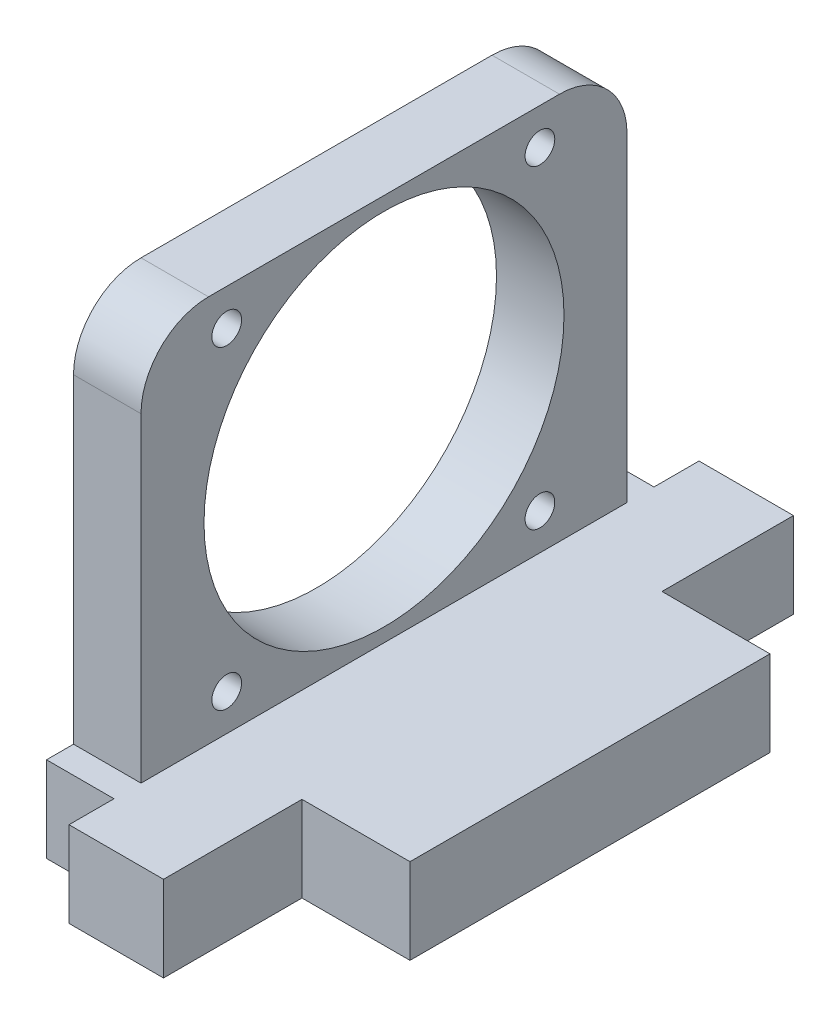
ISO-10303-21;
HEADER;
FILE_DESCRIPTION(('STEP AP214'),'2;1');
FILE_NAME('part.step','',(''),(''),'','','');
FILE_SCHEMA(('AUTOMOTIVE_DESIGN { 1 0 10303 214 1 1 1 1 }'));
ENDSEC;
DATA;
#1=APPLICATION_CONTEXT('core data for automotive mechanical design processes');
#2=APPLICATION_PROTOCOL_DEFINITION('international standard','automotive_design',2000,#1);
#3=PRODUCT_CONTEXT('',#1,'mechanical');
#4=PRODUCT('Part','Part','',(#3));
#5=PRODUCT_RELATED_PRODUCT_CATEGORY('part','',(#4));
#6=PRODUCT_DEFINITION_FORMATION('','',#4);
#7=PRODUCT_DEFINITION_CONTEXT('part definition',#1,'design');
#8=PRODUCT_DEFINITION('design','',#6,#7);
#9=PRODUCT_DEFINITION_SHAPE('','',#8);
#10=(LENGTH_UNIT() NAMED_UNIT(*) SI_UNIT(.MILLI.,.METRE.));
#11=(NAMED_UNIT(*) PLANE_ANGLE_UNIT() SI_UNIT($,.RADIAN.));
#12=(NAMED_UNIT(*) SI_UNIT($,.STERADIAN.) SOLID_ANGLE_UNIT());
#13=UNCERTAINTY_MEASURE_WITH_UNIT(LENGTH_MEASURE(1.E-05),#10,'distance_accuracy_value','');
#14=(GEOMETRIC_REPRESENTATION_CONTEXT(3) GLOBAL_UNCERTAINTY_ASSIGNED_CONTEXT((#13)) GLOBAL_UNIT_ASSIGNED_CONTEXT((#10,
#11,#12)) REPRESENTATION_CONTEXT('',''));
#15=CARTESIAN_POINT('',(0.,0.,0.));
#16=DIRECTION('',(0.,0.,1.));
#17=DIRECTION('',(1.,0.,0.));
#18=AXIS2_PLACEMENT_3D('',#15,#16,#17);
#19=CARTESIAN_POINT('',(0.,0.,120.));
#20=DIRECTION('',(0.,0.,1.));
#21=DIRECTION('',(1.,0.,0.));
#22=AXIS2_PLACEMENT_3D('',#19,#20,#21);
#23=PLANE('',#22);
#24=DIRECTION('',(1.,0.,0.));
#25=VECTOR('',#24,1.);
#26=CARTESIAN_POINT('',(0.,0.,120.));
#27=LINE('',#26,#25);
#28=CARTESIAN_POINT('',(0.,0.,120.));
#29=VERTEX_POINT('',#28);
#30=CARTESIAN_POINT('',(15.,0.,120.));
#31=VERTEX_POINT('',#30);
#32=EDGE_CURVE('E341',#29,#31,#27,.T.);
#33=ORIENTED_EDGE('',*,*,#32,.T.);
#34=DIRECTION('',(0.,1.,0.));
#35=VECTOR('',#34,1.);
#36=CARTESIAN_POINT('',(15.,-23.259406699226,120.));
#37=LINE('',#36,#35);
#38=CARTESIAN_POINT('',(15.,19.,120.));
#39=VERTEX_POINT('',#38);
#40=EDGE_CURVE('E200',#31,#39,#37,.T.);
#41=ORIENTED_EDGE('',*,*,#40,.T.);
#42=DIRECTION('',(-1.,0.,0.));
#43=VECTOR('',#42,1.);
#44=CARTESIAN_POINT('',(60.,19.,120.));
#45=LINE('',#44,#43);
#46=CARTESIAN_POINT('',(0.,19.,120.));
#47=VERTEX_POINT('',#46);
#48=EDGE_CURVE('E346',#39,#47,#45,.T.);
#49=ORIENTED_EDGE('',*,*,#48,.T.);
#50=DIRECTION('',(0.,-1.,0.));
#51=VECTOR('',#50,1.);
#52=CARTESIAN_POINT('',(0.,105.1,120.));
#53=LINE('',#52,#51);
#54=EDGE_CURVE('E338',#47,#29,#53,.T.);
#55=ORIENTED_EDGE('',*,*,#54,.T.);
#56=EDGE_LOOP('',(#33,#41,#49,#55));
#57=FACE_BOUND('',#56,.T.);
#58=ADVANCED_FACE('F43',(#57),#23,.T.);
#59=CARTESIAN_POINT('',(0.,0.,0.));
#60=DIRECTION('',(0.,0.,1.));
#61=DIRECTION('',(1.,0.,0.));
#62=AXIS2_PLACEMENT_3D('',#59,#60,#61);
#63=PLANE('',#62);
#64=DIRECTION('',(0.,1.,0.));
#65=VECTOR('',#64,1.);
#66=CARTESIAN_POINT('',(15.,-23.259406699226,0.));
#67=LINE('',#66,#65);
#68=CARTESIAN_POINT('',(15.,0.,0.));
#69=VERTEX_POINT('',#68);
#70=CARTESIAN_POINT('',(15.,19.,0.));
#71=VERTEX_POINT('',#70);
#72=EDGE_CURVE('E67',#69,#71,#67,.T.);
#73=ORIENTED_EDGE('',*,*,#72,.F.);
#74=DIRECTION('',(1.,0.,0.));
#75=VECTOR('',#74,1.);
#76=CARTESIAN_POINT('',(0.,0.,0.));
#77=LINE('',#76,#75);
#78=CARTESIAN_POINT('',(0.,0.,0.));
#79=VERTEX_POINT('',#78);
#80=EDGE_CURVE('E352',#79,#69,#77,.T.);
#81=ORIENTED_EDGE('',*,*,#80,.F.);
#82=DIRECTION('',(0.,-1.,0.));
#83=VECTOR('',#82,1.);
#84=CARTESIAN_POINT('',(0.,105.1,0.));
#85=LINE('',#84,#83);
#86=CARTESIAN_POINT('',(0.,19.,0.));
#87=VERTEX_POINT('',#86);
#88=EDGE_CURVE('E334',#87,#79,#85,.T.);
#89=ORIENTED_EDGE('',*,*,#88,.F.);
#90=DIRECTION('',(-1.,0.,0.));
#91=VECTOR('',#90,1.);
#92=CARTESIAN_POINT('',(60.,19.,0.));
#93=LINE('',#92,#91);
#94=EDGE_CURVE('E342',#71,#87,#93,.T.);
#95=ORIENTED_EDGE('',*,*,#94,.F.);
#96=EDGE_LOOP('',(#73,#81,#89,#95));
#97=FACE_BOUND('',#96,.T.);
#98=ADVANCED_FACE('F426',(#97),#63,.F.);
#99=CARTESIAN_POINT('',(0.,105.1,120.));
#100=DIRECTION('',(1.,0.,0.));
#101=DIRECTION('',(0.,1.,0.));
#102=AXIS2_PLACEMENT_3D('',#99,#100,#101);
#103=PLANE('',#102);
#104=CARTESIAN_POINT('',(0.,27.1,25.35));
#105=DIRECTION('',(1.,0.,0.));
#106=DIRECTION('',(0.,0.,1.));
#107=AXIS2_PLACEMENT_3D('',#104,#105,#106);
#108=CIRCLE('',#107,3.3);
#109=CARTESIAN_POINT('',(0.,27.1,28.65));
#110=VERTEX_POINT('',#109);
#111=EDGE_CURVE('E285',#110,#110,#108,.T.);
#112=ORIENTED_EDGE('',*,*,#111,.T.);
#113=EDGE_LOOP('',(#112));
#114=FACE_BOUND('',#113,.T.);
#115=CARTESIAN_POINT('',(0.,97.,25.35));
#116=DIRECTION('',(1.,0.,0.));
#117=DIRECTION('',(0.,0.,-1.));
#118=AXIS2_PLACEMENT_3D('',#115,#116,#117);
#119=CIRCLE('',#118,3.3);
#120=CARTESIAN_POINT('',(0.,97.,22.05));
#121=VERTEX_POINT('',#120);
#122=EDGE_CURVE('E319',#121,#121,#119,.T.);
#123=ORIENTED_EDGE('',*,*,#122,.T.);
#124=EDGE_LOOP('',(#123));
#125=FACE_BOUND('',#124,.T.);
#126=CARTESIAN_POINT('',(0.,27.1,94.95));
#127=DIRECTION('',(1.,0.,0.));
#128=DIRECTION('',(0.,0.,1.));
#129=AXIS2_PLACEMENT_3D('',#126,#127,#128);
#130=CIRCLE('',#129,3.29999999999999);
#131=CARTESIAN_POINT('',(0.,27.1,98.25));
#132=VERTEX_POINT('',#131);
#133=EDGE_CURVE('E311',#132,#132,#130,.T.);
#134=ORIENTED_EDGE('',*,*,#133,.T.);
#135=EDGE_LOOP('',(#134));
#136=FACE_BOUND('',#135,.T.);
#137=CARTESIAN_POINT('',(0.,97.,94.95));
#138=DIRECTION('',(1.,0.,0.));
#139=DIRECTION('',(0.,0.,-1.));
#140=AXIS2_PLACEMENT_3D('',#137,#138,#139);
#141=CIRCLE('',#140,3.29999999999999);
#142=CARTESIAN_POINT('',(0.,97.,91.65));
#143=VERTEX_POINT('',#142);
#144=EDGE_CURVE('E303',#143,#143,#141,.T.);
#145=ORIENTED_EDGE('',*,*,#144,.T.);
#146=EDGE_LOOP('',(#145));
#147=FACE_BOUND('',#146,.T.);
#148=CARTESIAN_POINT('',(0.,62.05,60.));
#149=DIRECTION('',(1.,0.,0.));
#150=DIRECTION('',(0.,0.,-1.));
#151=AXIS2_PLACEMENT_3D('',#148,#149,#150);
#152=CIRCLE('',#151,40.);
#153=CARTESIAN_POINT('',(0.,62.05,20.));
#154=VERTEX_POINT('',#153);
#155=EDGE_CURVE('E330',#154,#154,#152,.T.);
#156=ORIENTED_EDGE('',*,*,#155,.T.);
#157=EDGE_LOOP('',(#156));
#158=FACE_BOUND('',#157,.T.);
#159=DIRECTION('',(0.,0.,-1.));
#160=VECTOR('',#159,1.);
#161=CARTESIAN_POINT('',(0.,105.1,120.));
#162=LINE('',#161,#160);
#163=CARTESIAN_POINT('',(0.,105.1,99.));
#164=VERTEX_POINT('',#163);
#165=CARTESIAN_POINT('',(0.,105.1,21.));
#166=VERTEX_POINT('',#165);
#167=EDGE_CURVE('E349',#164,#166,#162,.T.);
#168=ORIENTED_EDGE('',*,*,#167,.T.);
#169=CARTESIAN_POINT('',(0.,90.1,21.));
#170=DIRECTION('',(1.,0.,0.));
#171=DIRECTION('',(0.,1.,0.));
#172=AXIS2_PLACEMENT_3D('',#169,#170,#171);
#173=CIRCLE('',#172,15.);
#174=CARTESIAN_POINT('',(0.,90.1,6.));
#175=VERTEX_POINT('',#174);
#176=EDGE_CURVE('E391',#166,#175,#173,.F.);
#177=ORIENTED_EDGE('',*,*,#176,.T.);
#178=DIRECTION('',(0.,-1.,0.));
#179=VECTOR('',#178,1.);
#180=CARTESIAN_POINT('',(0.,121.255494421404,6.));
#181=LINE('',#180,#179);
#182=CARTESIAN_POINT('',(0.,19.,6.));
#183=VERTEX_POINT('',#182);
#184=EDGE_CURVE('E282',#175,#183,#181,.T.);
#185=ORIENTED_EDGE('',*,*,#184,.T.);
#186=DIRECTION('',(0.,0.,1.));
#187=VECTOR('',#186,1.);
#188=CARTESIAN_POINT('',(0.,19.,0.));
#189=LINE('',#188,#187);
#190=EDGE_CURVE('E270',#87,#183,#189,.T.);
#191=ORIENTED_EDGE('',*,*,#190,.F.);
#192=ORIENTED_EDGE('',*,*,#88,.T.);
#193=DIRECTION('',(0.,0.,-1.));
#194=VECTOR('',#193,1.);
#195=CARTESIAN_POINT('',(0.,0.,120.));
#196=LINE('',#195,#194);
#197=EDGE_CURVE('E376',#29,#79,#196,.T.);
#198=ORIENTED_EDGE('',*,*,#197,.F.);
#199=ORIENTED_EDGE('',*,*,#54,.F.);
#200=DIRECTION('',(0.,0.,1.));
#201=VECTOR('',#200,1.);
#202=CARTESIAN_POINT('',(0.,19.,120.));
#203=LINE('',#202,#201);
#204=CARTESIAN_POINT('',(0.,19.,114.));
#205=VERTEX_POINT('',#204);
#206=EDGE_CURVE('E291',#205,#47,#203,.T.);
#207=ORIENTED_EDGE('',*,*,#206,.F.);
#208=DIRECTION('',(0.,-1.,0.));
#209=VECTOR('',#208,1.);
#210=CARTESIAN_POINT('',(0.,121.255494421404,114.));
#211=LINE('',#210,#209);
#212=CARTESIAN_POINT('',(0.,90.1,114.));
#213=VERTEX_POINT('',#212);
#214=EDGE_CURVE('E288',#213,#205,#211,.T.);
#215=ORIENTED_EDGE('',*,*,#214,.F.);
#216=CARTESIAN_POINT('',(0.,90.1,99.));
#217=DIRECTION('',(1.,0.,0.));
#218=DIRECTION('',(0.,1.,0.));
#219=AXIS2_PLACEMENT_3D('',#216,#217,#218);
#220=CIRCLE('',#219,15.);
#221=EDGE_CURVE('E388',#213,#164,#220,.F.);
#222=ORIENTED_EDGE('',*,*,#221,.T.);
#223=EDGE_LOOP('',(#168,#177,#185,#191,#192,#198,#199,#207,#215,#222));
#224=FACE_BOUND('',#223,.T.);
#225=ADVANCED_FACE('F415',(#114,#125,#136,#147,#158,#224),#103,.F.);
#226=CARTESIAN_POINT('',(15.,19.,120.));
#227=DIRECTION('',(-1.,0.,0.));
#228=DIRECTION('',(0.,0.,1.));
#229=AXIS2_PLACEMENT_3D('',#226,#227,#228);
#230=PLANE('',#229);
#231=CARTESIAN_POINT('',(15.,27.1,25.35));
#232=DIRECTION('',(1.,0.,0.));
#233=DIRECTION('',(0.,0.,1.));
#234=AXIS2_PLACEMENT_3D('',#231,#232,#233);
#235=CIRCLE('',#234,3.3);
#236=CARTESIAN_POINT('',(15.,27.1,28.65));
#237=VERTEX_POINT('',#236);
#238=EDGE_CURVE('E323',#237,#237,#235,.T.);
#239=ORIENTED_EDGE('',*,*,#238,.F.);
#240=EDGE_LOOP('',(#239));
#241=FACE_BOUND('',#240,.T.);
#242=CARTESIAN_POINT('',(15.,97.,25.35));
#243=DIRECTION('',(1.,0.,0.));
#244=DIRECTION('',(0.,0.,-1.));
#245=AXIS2_PLACEMENT_3D('',#242,#243,#244);
#246=CIRCLE('',#245,3.3);
#247=CARTESIAN_POINT('',(15.,97.,22.05));
#248=VERTEX_POINT('',#247);
#249=EDGE_CURVE('E315',#248,#248,#246,.T.);
#250=ORIENTED_EDGE('',*,*,#249,.F.);
#251=EDGE_LOOP('',(#250));
#252=FACE_BOUND('',#251,.T.);
#253=CARTESIAN_POINT('',(15.,27.1,94.95));
#254=DIRECTION('',(1.,0.,0.));
#255=DIRECTION('',(0.,0.,1.));
#256=AXIS2_PLACEMENT_3D('',#253,#254,#255);
#257=CIRCLE('',#256,3.29999999999999);
#258=CARTESIAN_POINT('',(15.,27.1,98.25));
#259=VERTEX_POINT('',#258);
#260=EDGE_CURVE('E307',#259,#259,#257,.T.);
#261=ORIENTED_EDGE('',*,*,#260,.F.);
#262=EDGE_LOOP('',(#261));
#263=FACE_BOUND('',#262,.T.);
#264=CARTESIAN_POINT('',(15.,97.,94.95));
#265=DIRECTION('',(1.,0.,0.));
#266=DIRECTION('',(0.,0.,-1.));
#267=AXIS2_PLACEMENT_3D('',#264,#265,#266);
#268=CIRCLE('',#267,3.29999999999999);
#269=CARTESIAN_POINT('',(15.,97.,91.65));
#270=VERTEX_POINT('',#269);
#271=EDGE_CURVE('E298',#270,#270,#268,.T.);
#272=ORIENTED_EDGE('',*,*,#271,.F.);
#273=EDGE_LOOP('',(#272));
#274=FACE_BOUND('',#273,.T.);
#275=CARTESIAN_POINT('',(15.,62.05,60.));
#276=DIRECTION('',(1.,0.,0.));
#277=DIRECTION('',(0.,0.,-1.));
#278=AXIS2_PLACEMENT_3D('',#275,#276,#277);
#279=CIRCLE('',#278,40.);
#280=CARTESIAN_POINT('',(15.,62.05,20.));
#281=VERTEX_POINT('',#280);
#282=EDGE_CURVE('E302',#281,#281,#279,.T.);
#283=ORIENTED_EDGE('',*,*,#282,.F.);
#284=EDGE_LOOP('',(#283));
#285=FACE_BOUND('',#284,.T.);
#286=DIRECTION('',(0.,-1.,0.));
#287=VECTOR('',#286,1.);
#288=CARTESIAN_POINT('',(15.,121.255494421404,6.00000000000001));
#289=LINE('',#288,#287);
#290=CARTESIAN_POINT('',(15.,90.1,6.00000000000001));
#291=VERTEX_POINT('',#290);
#292=CARTESIAN_POINT('',(15.,19.,6.00000000000001));
#293=VERTEX_POINT('',#292);
#294=EDGE_CURVE('E279',#291,#293,#289,.T.);
#295=ORIENTED_EDGE('',*,*,#294,.F.);
#296=CARTESIAN_POINT('',(15.,90.1,21.));
#297=DIRECTION('',(-1.,0.,0.));
#298=DIRECTION('',(0.,0.,1.));
#299=AXIS2_PLACEMENT_3D('',#296,#297,#298);
#300=CIRCLE('',#299,15.);
#301=CARTESIAN_POINT('',(15.,105.1,21.));
#302=VERTEX_POINT('',#301);
#303=EDGE_CURVE('E52',#291,#302,#300,.F.);
#304=ORIENTED_EDGE('',*,*,#303,.T.);
#305=DIRECTION('',(0.,0.,-1.));
#306=VECTOR('',#305,1.);
#307=CARTESIAN_POINT('',(15.,105.1,120.));
#308=LINE('',#307,#306);
#309=CARTESIAN_POINT('',(15.,105.1,99.));
#310=VERTEX_POINT('',#309);
#311=EDGE_CURVE('E360',#310,#302,#308,.T.);
#312=ORIENTED_EDGE('',*,*,#311,.F.);
#313=CARTESIAN_POINT('',(15.,90.1,99.));
#314=DIRECTION('',(-1.,0.,0.));
#315=DIRECTION('',(0.,0.,1.));
#316=AXIS2_PLACEMENT_3D('',#313,#314,#315);
#317=CIRCLE('',#316,15.);
#318=CARTESIAN_POINT('',(15.,90.1,114.));
#319=VERTEX_POINT('',#318);
#320=EDGE_CURVE('E397',#310,#319,#317,.F.);
#321=ORIENTED_EDGE('',*,*,#320,.T.);
#322=DIRECTION('',(0.,-1.,0.));
#323=VECTOR('',#322,1.);
#324=CARTESIAN_POINT('',(15.,121.255494421404,114.));
#325=LINE('',#324,#323);
#326=CARTESIAN_POINT('',(15.,19.,114.));
#327=VERTEX_POINT('',#326);
#328=EDGE_CURVE('E247',#319,#327,#325,.T.);
#329=ORIENTED_EDGE('',*,*,#328,.T.);
#330=DIRECTION('',(0.,0.,-1.));
#331=VECTOR('',#330,1.);
#332=CARTESIAN_POINT('',(15.,19.,120.));
#333=LINE('',#332,#331);
#334=EDGE_CURVE('E364',#327,#293,#333,.T.);
#335=ORIENTED_EDGE('',*,*,#334,.T.);
#336=EDGE_LOOP('',(#295,#304,#312,#321,#329,#335));
#337=FACE_BOUND('',#336,.T.);
#338=ADVANCED_FACE('F404',(#241,#252,#263,#274,#285,#337),#230,.F.);
#339=CARTESIAN_POINT('',(15.,105.1,120.));
#340=DIRECTION('',(0.,-1.,0.));
#341=DIRECTION('',(0.,0.,-1.));
#342=AXIS2_PLACEMENT_3D('',#339,#340,#341);
#343=PLANE('',#342);
#344=ORIENTED_EDGE('',*,*,#311,.T.);
#345=DIRECTION('',(-1.,0.,0.));
#346=VECTOR('',#345,1.);
#347=CARTESIAN_POINT('',(0.,105.1,21.));
#348=LINE('',#347,#346);
#349=EDGE_CURVE('E384',#302,#166,#348,.T.);
#350=ORIENTED_EDGE('',*,*,#349,.T.);
#351=ORIENTED_EDGE('',*,*,#167,.F.);
#352=DIRECTION('',(1.,0.,0.));
#353=VECTOR('',#352,1.);
#354=CARTESIAN_POINT('',(15.,105.1,99.));
#355=LINE('',#354,#353);
#356=EDGE_CURVE('E380',#164,#310,#355,.T.);
#357=ORIENTED_EDGE('',*,*,#356,.T.);
#358=EDGE_LOOP('',(#344,#350,#351,#357));
#359=FACE_BOUND('',#358,.T.);
#360=ADVANCED_FACE('F409',(#359),#343,.F.);
#361=CARTESIAN_POINT('',(0.,0.,120.));
#362=DIRECTION('',(0.,1.,0.));
#363=DIRECTION('',(0.,0.,1.));
#364=AXIS2_PLACEMENT_3D('',#361,#362,#363);
#365=PLANE('',#364);
#366=DIRECTION('',(-1.,0.,0.));
#367=VECTOR('',#366,1.);
#368=CARTESIAN_POINT('',(60.,0.,99.2244017278364));
#369=LINE('',#368,#367);
#370=CARTESIAN_POINT('',(60.,0.,99.2244017278364));
#371=VERTEX_POINT('',#370);
#372=CARTESIAN_POINT('',(36.,0.,99.2244017278364));
#373=VERTEX_POINT('',#372);
#374=EDGE_CURVE('E176',#371,#373,#369,.T.);
#375=ORIENTED_EDGE('',*,*,#374,.T.);
#376=DIRECTION('',(0.,0.,1.));
#377=VECTOR('',#376,1.);
#378=CARTESIAN_POINT('',(36.,0.,120.));
#379=LINE('',#378,#377);
#380=CARTESIAN_POINT('',(36.,0.,130.));
#381=VERTEX_POINT('',#380);
#382=EDGE_CURVE('E170',#373,#381,#379,.T.);
#383=ORIENTED_EDGE('',*,*,#382,.T.);
#384=DIRECTION('',(-1.,0.,0.));
#385=VECTOR('',#384,1.);
#386=CARTESIAN_POINT('',(36.,0.,130.));
#387=LINE('',#386,#385);
#388=CARTESIAN_POINT('',(15.,0.,130.));
#389=VERTEX_POINT('',#388);
#390=EDGE_CURVE('E173',#381,#389,#387,.T.);
#391=ORIENTED_EDGE('',*,*,#390,.T.);
#392=DIRECTION('',(0.,0.,-1.));
#393=VECTOR('',#392,1.);
#394=CARTESIAN_POINT('',(15.,0.,130.));
#395=LINE('',#394,#393);
#396=EDGE_CURVE('E191',#389,#31,#395,.T.);
#397=ORIENTED_EDGE('',*,*,#396,.T.);
#398=ORIENTED_EDGE('',*,*,#32,.F.);
#399=ORIENTED_EDGE('',*,*,#197,.T.);
#400=ORIENTED_EDGE('',*,*,#80,.T.);
#401=DIRECTION('',(0.,0.,-1.));
#402=VECTOR('',#401,1.);
#403=CARTESIAN_POINT('',(15.,0.,0.));
#404=LINE('',#403,#402);
#405=CARTESIAN_POINT('',(15.,0.,-10.));
#406=VERTEX_POINT('',#405);
#407=EDGE_CURVE('E211',#69,#406,#404,.T.);
#408=ORIENTED_EDGE('',*,*,#407,.T.);
#409=DIRECTION('',(1.,0.,0.));
#410=VECTOR('',#409,1.);
#411=CARTESIAN_POINT('',(36.,0.,-10.));
#412=LINE('',#411,#410);
#413=CARTESIAN_POINT('',(36.,0.,-10.));
#414=VERTEX_POINT('',#413);
#415=EDGE_CURVE('E214',#406,#414,#412,.T.);
#416=ORIENTED_EDGE('',*,*,#415,.T.);
#417=DIRECTION('',(0.,0.,1.));
#418=VECTOR('',#417,1.);
#419=CARTESIAN_POINT('',(36.,0.,0.));
#420=LINE('',#419,#418);
#421=CARTESIAN_POINT('',(36.,0.,19.2244017278364));
#422=VERTEX_POINT('',#421);
#423=EDGE_CURVE('E260',#414,#422,#420,.T.);
#424=ORIENTED_EDGE('',*,*,#423,.T.);
#425=DIRECTION('',(1.,0.,0.));
#426=VECTOR('',#425,1.);
#427=CARTESIAN_POINT('',(60.,0.,19.2244017278364));
#428=LINE('',#427,#426);
#429=CARTESIAN_POINT('',(60.,0.,19.2244017278364));
#430=VERTEX_POINT('',#429);
#431=EDGE_CURVE('E253',#422,#430,#428,.T.);
#432=ORIENTED_EDGE('',*,*,#431,.T.);
#433=DIRECTION('',(0.,0.,-1.));
#434=VECTOR('',#433,1.);
#435=CARTESIAN_POINT('',(60.,0.,120.));
#436=LINE('',#435,#434);
#437=EDGE_CURVE('E372',#371,#430,#436,.T.);
#438=ORIENTED_EDGE('',*,*,#437,.F.);
#439=EDGE_LOOP('',(#375,#383,#391,#397,#398,#399,#400,#408,#416,#424,#432,#438));
#440=FACE_BOUND('',#439,.T.);
#441=ADVANCED_FACE('F172',(#440),#365,.F.);
#442=CARTESIAN_POINT('',(60.,0.,120.));
#443=DIRECTION('',(-1.,0.,0.));
#444=DIRECTION('',(0.,0.,1.));
#445=AXIS2_PLACEMENT_3D('',#442,#443,#444);
#446=PLANE('',#445);
#447=DIRECTION('',(0.,0.,-1.));
#448=VECTOR('',#447,1.);
#449=CARTESIAN_POINT('',(60.,19.,120.));
#450=LINE('',#449,#448);
#451=CARTESIAN_POINT('',(60.,19.,99.2244017278364));
#452=VERTEX_POINT('',#451);
#453=CARTESIAN_POINT('',(60.,19.,19.2244017278364));
#454=VERTEX_POINT('',#453);
#455=EDGE_CURVE('E368',#452,#454,#450,.T.);
#456=ORIENTED_EDGE('',*,*,#455,.F.);
#457=DIRECTION('',(0.,1.,0.));
#458=VECTOR('',#457,1.);
#459=CARTESIAN_POINT('',(60.,0.,99.2244017278364));
#460=LINE('',#459,#458);
#461=EDGE_CURVE('E180',#371,#452,#460,.T.);
#462=ORIENTED_EDGE('',*,*,#461,.F.);
#463=ORIENTED_EDGE('',*,*,#437,.T.);
#464=DIRECTION('',(0.,1.,0.));
#465=VECTOR('',#464,1.);
#466=CARTESIAN_POINT('',(60.,0.,19.2244017278364));
#467=LINE('',#466,#465);
#468=EDGE_CURVE('E234',#430,#454,#467,.T.);
#469=ORIENTED_EDGE('',*,*,#468,.T.);
#470=EDGE_LOOP('',(#456,#462,#463,#469));
#471=FACE_BOUND('',#470,.T.);
#472=ADVANCED_FACE('F466',(#471),#446,.F.);
#473=CARTESIAN_POINT('',(60.,19.,120.));
#474=DIRECTION('',(0.,-1.,0.));
#475=DIRECTION('',(1.,0.,0.));
#476=AXIS2_PLACEMENT_3D('',#473,#474,#475);
#477=PLANE('',#476);
#478=ORIENTED_EDGE('',*,*,#48,.F.);
#479=DIRECTION('',(0.,0.,1.));
#480=VECTOR('',#479,1.);
#481=CARTESIAN_POINT('',(15.,19.,130.));
#482=LINE('',#481,#480);
#483=CARTESIAN_POINT('',(15.,19.,130.));
#484=VERTEX_POINT('',#483);
#485=EDGE_CURVE('E59',#39,#484,#482,.T.);
#486=ORIENTED_EDGE('',*,*,#485,.T.);
#487=DIRECTION('',(1.,0.,0.));
#488=VECTOR('',#487,1.);
#489=CARTESIAN_POINT('',(36.,19.,130.));
#490=LINE('',#489,#488);
#491=CARTESIAN_POINT('',(36.,19.,130.));
#492=VERTEX_POINT('',#491);
#493=EDGE_CURVE('E205',#484,#492,#490,.T.);
#494=ORIENTED_EDGE('',*,*,#493,.T.);
#495=DIRECTION('',(0.,0.,1.));
#496=VECTOR('',#495,1.);
#497=CARTESIAN_POINT('',(36.,19.,120.));
#498=LINE('',#497,#496);
#499=CARTESIAN_POINT('',(36.,19.,99.2244017278364));
#500=VERTEX_POINT('',#499);
#501=EDGE_CURVE('E195',#500,#492,#498,.T.);
#502=ORIENTED_EDGE('',*,*,#501,.F.);
#503=DIRECTION('',(-1.,0.,0.));
#504=VECTOR('',#503,1.);
#505=CARTESIAN_POINT('',(60.,19.,99.2244017278364));
#506=LINE('',#505,#504);
#507=EDGE_CURVE('E237',#452,#500,#506,.T.);
#508=ORIENTED_EDGE('',*,*,#507,.F.);
#509=ORIENTED_EDGE('',*,*,#455,.T.);
#510=DIRECTION('',(1.,0.,0.));
#511=VECTOR('',#510,1.);
#512=CARTESIAN_POINT('',(60.,19.,19.2244017278364));
#513=LINE('',#512,#511);
#514=CARTESIAN_POINT('',(36.,19.,19.2244017278364));
#515=VERTEX_POINT('',#514);
#516=EDGE_CURVE('E257',#515,#454,#513,.T.);
#517=ORIENTED_EDGE('',*,*,#516,.F.);
#518=DIRECTION('',(0.,0.,1.));
#519=VECTOR('',#518,1.);
#520=CARTESIAN_POINT('',(36.,19.,0.));
#521=LINE('',#520,#519);
#522=CARTESIAN_POINT('',(36.,19.,-10.));
#523=VERTEX_POINT('',#522);
#524=EDGE_CURVE('E241',#523,#515,#521,.T.);
#525=ORIENTED_EDGE('',*,*,#524,.F.);
#526=DIRECTION('',(-1.,0.,0.));
#527=VECTOR('',#526,1.);
#528=CARTESIAN_POINT('',(36.,19.,-10.));
#529=LINE('',#528,#527);
#530=CARTESIAN_POINT('',(15.,19.,-10.));
#531=VERTEX_POINT('',#530);
#532=EDGE_CURVE('E209',#523,#531,#529,.T.);
#533=ORIENTED_EDGE('',*,*,#532,.T.);
#534=DIRECTION('',(0.,0.,1.));
#535=VECTOR('',#534,1.);
#536=CARTESIAN_POINT('',(15.,19.,0.));
#537=LINE('',#536,#535);
#538=EDGE_CURVE('E218',#531,#71,#537,.T.);
#539=ORIENTED_EDGE('',*,*,#538,.T.);
#540=ORIENTED_EDGE('',*,*,#94,.T.);
#541=ORIENTED_EDGE('',*,*,#190,.T.);
#542=DIRECTION('',(1.,0.,0.));
#543=VECTOR('',#542,1.);
#544=CARTESIAN_POINT('',(0.,19.,6.));
#545=LINE('',#544,#543);
#546=EDGE_CURVE('E274',#183,#293,#545,.T.);
#547=ORIENTED_EDGE('',*,*,#546,.T.);
#548=ORIENTED_EDGE('',*,*,#334,.F.);
#549=DIRECTION('',(-1.,0.,0.));
#550=VECTOR('',#549,1.);
#551=CARTESIAN_POINT('',(15.,19.,114.));
#552=LINE('',#551,#550);
#553=EDGE_CURVE('E275',#327,#205,#552,.T.);
#554=ORIENTED_EDGE('',*,*,#553,.T.);
#555=ORIENTED_EDGE('',*,*,#206,.T.);
#556=EDGE_LOOP('',(#478,#486,#494,#502,#508,#509,#517,#525,#533,#539,#540,#541,#547,#548,#554,#555));
#557=FACE_BOUND('',#556,.T.);
#558=ADVANCED_FACE('F423',(#557),#477,.F.);
#559=CARTESIAN_POINT('',(0.,62.05,60.));
#560=DIRECTION('',(1.,0.,0.));
#561=DIRECTION('',(0.,0.,-1.));
#562=AXIS2_PLACEMENT_3D('',#559,#560,#561);
#563=CYLINDRICAL_SURFACE('',#562,40.);
#564=ORIENTED_EDGE('',*,*,#155,.F.);
#565=EDGE_LOOP('',(#564));
#566=FACE_BOUND('',#565,.T.);
#567=ORIENTED_EDGE('',*,*,#282,.T.);
#568=EDGE_LOOP('',(#567));
#569=FACE_BOUND('',#568,.T.);
#570=ADVANCED_FACE('F456',(#566,#569),#563,.F.);
#571=CARTESIAN_POINT('',(0.,97.,94.95));
#572=DIRECTION('',(1.,0.,0.));
#573=DIRECTION('',(0.,0.,-1.));
#574=AXIS2_PLACEMENT_3D('',#571,#572,#573);
#575=CYLINDRICAL_SURFACE('',#574,3.29999999999999);
#576=ORIENTED_EDGE('',*,*,#144,.F.);
#577=EDGE_LOOP('',(#576));
#578=FACE_BOUND('',#577,.T.);
#579=ORIENTED_EDGE('',*,*,#271,.T.);
#580=EDGE_LOOP('',(#579));
#581=FACE_BOUND('',#580,.T.);
#582=ADVANCED_FACE('F488',(#578,#581),#575,.F.);
#583=CARTESIAN_POINT('',(0.,27.1,94.95));
#584=DIRECTION('',(1.,0.,0.));
#585=DIRECTION('',(0.,0.,-1.));
#586=AXIS2_PLACEMENT_3D('',#583,#584,#585);
#587=CYLINDRICAL_SURFACE('',#586,3.29999999999999);
#588=ORIENTED_EDGE('',*,*,#133,.F.);
#589=EDGE_LOOP('',(#588));
#590=FACE_BOUND('',#589,.T.);
#591=ORIENTED_EDGE('',*,*,#260,.T.);
#592=EDGE_LOOP('',(#591));
#593=FACE_BOUND('',#592,.T.);
#594=ADVANCED_FACE('F494',(#590,#593),#587,.F.);
#595=CARTESIAN_POINT('',(0.,97.,25.35));
#596=DIRECTION('',(1.,0.,0.));
#597=DIRECTION('',(0.,0.,-1.));
#598=AXIS2_PLACEMENT_3D('',#595,#596,#597);
#599=CYLINDRICAL_SURFACE('',#598,3.3);
#600=ORIENTED_EDGE('',*,*,#122,.F.);
#601=EDGE_LOOP('',(#600));
#602=FACE_BOUND('',#601,.T.);
#603=ORIENTED_EDGE('',*,*,#249,.T.);
#604=EDGE_LOOP('',(#603));
#605=FACE_BOUND('',#604,.T.);
#606=ADVANCED_FACE('F500',(#602,#605),#599,.F.);
#607=CARTESIAN_POINT('',(0.,27.1,25.35));
#608=DIRECTION('',(1.,0.,0.));
#609=DIRECTION('',(0.,0.,-1.));
#610=AXIS2_PLACEMENT_3D('',#607,#608,#609);
#611=CYLINDRICAL_SURFACE('',#610,3.3);
#612=ORIENTED_EDGE('',*,*,#111,.F.);
#613=EDGE_LOOP('',(#612));
#614=FACE_BOUND('',#613,.T.);
#615=ORIENTED_EDGE('',*,*,#238,.T.);
#616=EDGE_LOOP('',(#615));
#617=FACE_BOUND('',#616,.T.);
#618=ADVANCED_FACE('F508',(#614,#617),#611,.F.);
#619=CARTESIAN_POINT('',(0.,121.255494421404,6.));
#620=DIRECTION('',(0.,0.,-1.));
#621=DIRECTION('',(-1.,0.,0.));
#622=AXIS2_PLACEMENT_3D('',#619,#620,#621);
#623=PLANE('',#622);
#624=ORIENTED_EDGE('',*,*,#184,.F.);
#625=DIRECTION('',(-1.,0.,0.));
#626=VECTOR('',#625,1.);
#627=CARTESIAN_POINT('',(15.,90.1,6.00000000000001));
#628=LINE('',#627,#626);
#629=EDGE_CURVE('E394',#175,#291,#628,.F.);
#630=ORIENTED_EDGE('',*,*,#629,.T.);
#631=ORIENTED_EDGE('',*,*,#294,.T.);
#632=ORIENTED_EDGE('',*,*,#546,.F.);
#633=EDGE_LOOP('',(#624,#630,#631,#632));
#634=FACE_BOUND('',#633,.T.);
#635=ADVANCED_FACE('F419',(#634),#623,.T.);
#636=CARTESIAN_POINT('',(15.,121.255494421404,114.));
#637=DIRECTION('',(0.,0.,1.));
#638=DIRECTION('',(1.,0.,0.));
#639=AXIS2_PLACEMENT_3D('',#636,#637,#638);
#640=PLANE('',#639);
#641=ORIENTED_EDGE('',*,*,#328,.F.);
#642=DIRECTION('',(1.,0.,0.));
#643=VECTOR('',#642,1.);
#644=CARTESIAN_POINT('',(0.,90.1,114.));
#645=LINE('',#644,#643);
#646=EDGE_CURVE('E11',#319,#213,#645,.F.);
#647=ORIENTED_EDGE('',*,*,#646,.T.);
#648=ORIENTED_EDGE('',*,*,#214,.T.);
#649=ORIENTED_EDGE('',*,*,#553,.F.);
#650=EDGE_LOOP('',(#641,#647,#648,#649));
#651=FACE_BOUND('',#650,.T.);
#652=ADVANCED_FACE('F436',(#651),#640,.T.);
#653=CARTESIAN_POINT('',(15.,90.1,21.));
#654=DIRECTION('',(1.,0.,0.));
#655=DIRECTION('',(0.,0.,-1.));
#656=AXIS2_PLACEMENT_3D('',#653,#654,#655);
#657=CYLINDRICAL_SURFACE('',#656,15.);
#658=ORIENTED_EDGE('',*,*,#303,.F.);
#659=ORIENTED_EDGE('',*,*,#629,.F.);
#660=ORIENTED_EDGE('',*,*,#176,.F.);
#661=ORIENTED_EDGE('',*,*,#349,.F.);
#662=EDGE_LOOP('',(#658,#659,#660,#661));
#663=FACE_BOUND('',#662,.T.);
#664=ADVANCED_FACE('F412',(#663),#657,.T.);
#665=CARTESIAN_POINT('',(15.,90.1,99.));
#666=DIRECTION('',(-1.,0.,0.));
#667=DIRECTION('',(0.,0.,1.));
#668=AXIS2_PLACEMENT_3D('',#665,#666,#667);
#669=CYLINDRICAL_SURFACE('',#668,15.);
#670=ORIENTED_EDGE('',*,*,#221,.F.);
#671=ORIENTED_EDGE('',*,*,#646,.F.);
#672=ORIENTED_EDGE('',*,*,#320,.F.);
#673=ORIENTED_EDGE('',*,*,#356,.F.);
#674=EDGE_LOOP('',(#670,#671,#672,#673));
#675=FACE_BOUND('',#674,.T.);
#676=ADVANCED_FACE('F45',(#675),#669,.T.);
#677=CARTESIAN_POINT('',(60.,0.,19.2244017278364));
#678=DIRECTION('',(0.,0.,1.));
#679=DIRECTION('',(1.,0.,0.));
#680=AXIS2_PLACEMENT_3D('',#677,#678,#679);
#681=PLANE('',#680);
#682=ORIENTED_EDGE('',*,*,#516,.T.);
#683=ORIENTED_EDGE('',*,*,#468,.F.);
#684=ORIENTED_EDGE('',*,*,#431,.F.);
#685=DIRECTION('',(0.,1.,0.));
#686=VECTOR('',#685,1.);
#687=CARTESIAN_POINT('',(36.,0.,19.2244017278364));
#688=LINE('',#687,#686);
#689=EDGE_CURVE('E250',#422,#515,#688,.T.);
#690=ORIENTED_EDGE('',*,*,#689,.T.);
#691=EDGE_LOOP('',(#682,#683,#684,#690));
#692=FACE_BOUND('',#691,.T.);
#693=ADVANCED_FACE('F441',(#692),#681,.F.);
#694=CARTESIAN_POINT('',(36.,0.,0.));
#695=DIRECTION('',(-1.,0.,0.));
#696=DIRECTION('',(0.,-1.,0.));
#697=AXIS2_PLACEMENT_3D('',#694,#695,#696);
#698=PLANE('',#697);
#699=ORIENTED_EDGE('',*,*,#524,.T.);
#700=ORIENTED_EDGE('',*,*,#689,.F.);
#701=ORIENTED_EDGE('',*,*,#423,.F.);
#702=DIRECTION('',(0.,1.,0.));
#703=VECTOR('',#702,1.);
#704=CARTESIAN_POINT('',(36.,-23.259406699226,-10.));
#705=LINE('',#704,#703);
#706=EDGE_CURVE('E222',#414,#523,#705,.T.);
#707=ORIENTED_EDGE('',*,*,#706,.T.);
#708=EDGE_LOOP('',(#699,#700,#701,#707));
#709=FACE_BOUND('',#708,.T.);
#710=ADVANCED_FACE('F446',(#709),#698,.F.);
#711=CARTESIAN_POINT('',(36.,0.,120.));
#712=DIRECTION('',(-1.,0.,0.));
#713=DIRECTION('',(0.,-1.,0.));
#714=AXIS2_PLACEMENT_3D('',#711,#712,#713);
#715=PLANE('',#714);
#716=ORIENTED_EDGE('',*,*,#501,.T.);
#717=DIRECTION('',(0.,1.,0.));
#718=VECTOR('',#717,1.);
#719=CARTESIAN_POINT('',(36.,-23.259406699226,130.));
#720=LINE('',#719,#718);
#721=EDGE_CURVE('E187',#381,#492,#720,.T.);
#722=ORIENTED_EDGE('',*,*,#721,.F.);
#723=ORIENTED_EDGE('',*,*,#382,.F.);
#724=DIRECTION('',(0.,1.,0.));
#725=VECTOR('',#724,1.);
#726=CARTESIAN_POINT('',(36.,0.,99.2244017278364));
#727=LINE('',#726,#725);
#728=EDGE_CURVE('E244',#373,#500,#727,.T.);
#729=ORIENTED_EDGE('',*,*,#728,.T.);
#730=EDGE_LOOP('',(#716,#722,#723,#729));
#731=FACE_BOUND('',#730,.T.);
#732=ADVANCED_FACE('F193',(#731),#715,.F.);
#733=CARTESIAN_POINT('',(60.,0.,99.2244017278364));
#734=DIRECTION('',(0.,0.,-1.));
#735=DIRECTION('',(-1.,0.,0.));
#736=AXIS2_PLACEMENT_3D('',#733,#734,#735);
#737=PLANE('',#736);
#738=ORIENTED_EDGE('',*,*,#507,.T.);
#739=ORIENTED_EDGE('',*,*,#728,.F.);
#740=ORIENTED_EDGE('',*,*,#374,.F.);
#741=ORIENTED_EDGE('',*,*,#461,.T.);
#742=EDGE_LOOP('',(#738,#739,#740,#741));
#743=FACE_BOUND('',#742,.T.);
#744=ADVANCED_FACE('F532',(#743),#737,.F.);
#745=CARTESIAN_POINT('',(15.,-23.259406699226,0.));
#746=DIRECTION('',(-1.,0.,0.));
#747=DIRECTION('',(0.,0.,1.));
#748=AXIS2_PLACEMENT_3D('',#745,#746,#747);
#749=PLANE('',#748);
#750=ORIENTED_EDGE('',*,*,#407,.F.);
#751=ORIENTED_EDGE('',*,*,#72,.T.);
#752=ORIENTED_EDGE('',*,*,#538,.F.);
#753=DIRECTION('',(0.,1.,0.));
#754=VECTOR('',#753,1.);
#755=CARTESIAN_POINT('',(15.,-23.259406699226,-10.));
#756=LINE('',#755,#754);
#757=EDGE_CURVE('E225',#406,#531,#756,.T.);
#758=ORIENTED_EDGE('',*,*,#757,.F.);
#759=EDGE_LOOP('',(#750,#751,#752,#758));
#760=FACE_BOUND('',#759,.T.);
#761=ADVANCED_FACE('F535',(#760),#749,.T.);
#762=CARTESIAN_POINT('',(36.,-23.259406699226,-10.));
#763=DIRECTION('',(0.,0.,-1.));
#764=DIRECTION('',(-1.,0.,0.));
#765=AXIS2_PLACEMENT_3D('',#762,#763,#764);
#766=PLANE('',#765);
#767=ORIENTED_EDGE('',*,*,#415,.F.);
#768=ORIENTED_EDGE('',*,*,#757,.T.);
#769=ORIENTED_EDGE('',*,*,#532,.F.);
#770=ORIENTED_EDGE('',*,*,#706,.F.);
#771=EDGE_LOOP('',(#767,#768,#769,#770));
#772=FACE_BOUND('',#771,.T.);
#773=ADVANCED_FACE('F539',(#772),#766,.T.);
#774=CARTESIAN_POINT('',(36.,-23.259406699226,130.));
#775=DIRECTION('',(0.,0.,1.));
#776=DIRECTION('',(1.,0.,0.));
#777=AXIS2_PLACEMENT_3D('',#774,#775,#776);
#778=PLANE('',#777);
#779=ORIENTED_EDGE('',*,*,#390,.F.);
#780=ORIENTED_EDGE('',*,*,#721,.T.);
#781=ORIENTED_EDGE('',*,*,#493,.F.);
#782=DIRECTION('',(0.,1.,0.));
#783=VECTOR('',#782,1.);
#784=CARTESIAN_POINT('',(15.,-23.259406699226,130.));
#785=LINE('',#784,#783);
#786=EDGE_CURVE('E189',#389,#484,#785,.T.);
#787=ORIENTED_EDGE('',*,*,#786,.F.);
#788=EDGE_LOOP('',(#779,#780,#781,#787));
#789=FACE_BOUND('',#788,.T.);
#790=ADVANCED_FACE('F185',(#789),#778,.T.);
#791=CARTESIAN_POINT('',(15.,-23.259406699226,130.));
#792=DIRECTION('',(-1.,0.,0.));
#793=DIRECTION('',(0.,-1.,0.));
#794=AXIS2_PLACEMENT_3D('',#791,#792,#793);
#795=PLANE('',#794);
#796=ORIENTED_EDGE('',*,*,#396,.F.);
#797=ORIENTED_EDGE('',*,*,#786,.T.);
#798=ORIENTED_EDGE('',*,*,#485,.F.);
#799=ORIENTED_EDGE('',*,*,#40,.F.);
#800=EDGE_LOOP('',(#796,#797,#798,#799));
#801=FACE_BOUND('',#800,.T.);
#802=ADVANCED_FACE('F548',(#801),#795,.T.);
#803=CLOSED_SHELL('',(#58,#98,#225,#338,#360,#441,#472,#558,#570,#582,#594,#606,#618,#635,#652,
#664,#676,#693,#710,#732,#744,#761,#773,#790,#802));
#804=MANIFOLD_SOLID_BREP('B2',#803);
#805=ADVANCED_BREP_SHAPE_REPRESENTATION('',(#18,#804),#14);
#806=SHAPE_DEFINITION_REPRESENTATION(#9,#805);
ENDSEC;
END-ISO-10303-21;
